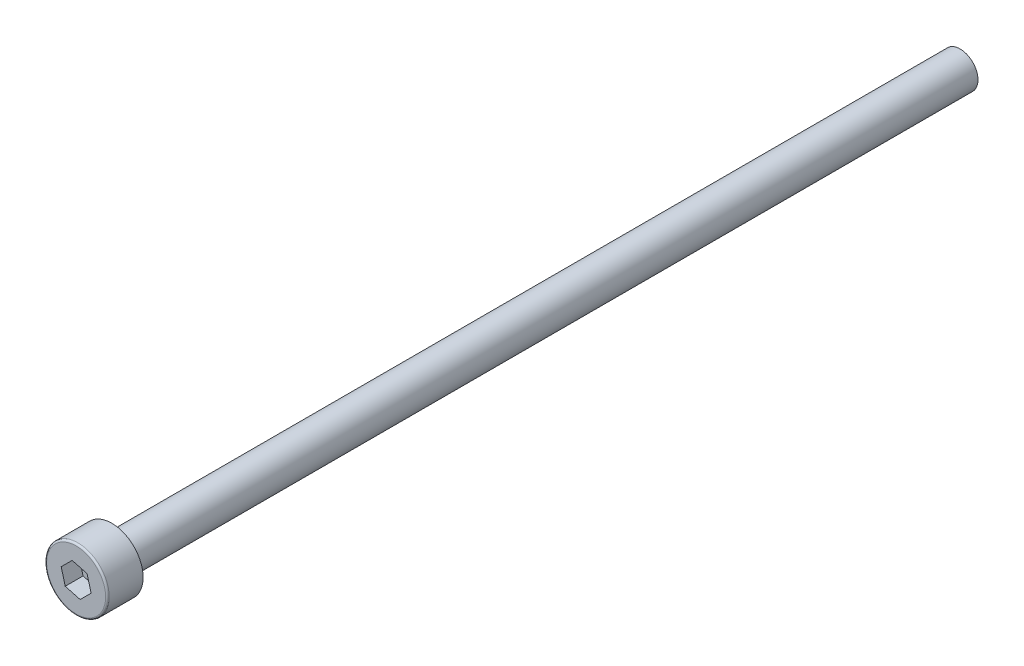
ISO-10303-21;
HEADER;
FILE_DESCRIPTION(('STEP AP214'),'2;1');
FILE_NAME('part.step','',(''),(''),'','','');
FILE_SCHEMA(('AUTOMOTIVE_DESIGN { 1 0 10303 214 1 1 1 1 }'));
ENDSEC;
DATA;
#1=APPLICATION_CONTEXT('core data for automotive mechanical design processes');
#2=APPLICATION_PROTOCOL_DEFINITION('international standard','automotive_design',2000,#1);
#3=PRODUCT_CONTEXT('',#1,'mechanical');
#4=PRODUCT('Part','Part','',(#3));
#5=PRODUCT_RELATED_PRODUCT_CATEGORY('part','',(#4));
#6=PRODUCT_DEFINITION_FORMATION('','',#4);
#7=PRODUCT_DEFINITION_CONTEXT('part definition',#1,'design');
#8=PRODUCT_DEFINITION('design','',#6,#7);
#9=PRODUCT_DEFINITION_SHAPE('','',#8);
#10=(LENGTH_UNIT() NAMED_UNIT(*) SI_UNIT(.MILLI.,.METRE.));
#11=(NAMED_UNIT(*) PLANE_ANGLE_UNIT() SI_UNIT($,.RADIAN.));
#12=(NAMED_UNIT(*) SI_UNIT($,.STERADIAN.) SOLID_ANGLE_UNIT());
#13=UNCERTAINTY_MEASURE_WITH_UNIT(LENGTH_MEASURE(1.E-05),#10,'distance_accuracy_value','');
#14=(GEOMETRIC_REPRESENTATION_CONTEXT(3) GLOBAL_UNCERTAINTY_ASSIGNED_CONTEXT((#13)) GLOBAL_UNIT_ASSIGNED_CONTEXT((#10,
#11,#12)) REPRESENTATION_CONTEXT('',''));
#15=CARTESIAN_POINT('',(0.,0.,0.));
#16=DIRECTION('',(0.,0.,1.));
#17=DIRECTION('',(1.,0.,0.));
#18=AXIS2_PLACEMENT_3D('',#15,#16,#17);
#19=CARTESIAN_POINT('',(0.,0.,0.));
#20=DIRECTION('',(0.,0.,1.));
#21=DIRECTION('',(1.,0.,0.));
#22=AXIS2_PLACEMENT_3D('',#19,#20,#21);
#23=PLANE('',#22);
#24=CARTESIAN_POINT('',(0.,0.,0.));
#25=DIRECTION('',(0.,0.,1.));
#26=DIRECTION('',(1.,0.,0.));
#27=AXIS2_PLACEMENT_3D('',#24,#25,#26);
#28=CIRCLE('',#27,3.5);
#29=CARTESIAN_POINT('',(3.5,0.,0.));
#30=VERTEX_POINT('',#29);
#31=EDGE_CURVE('E138',#30,#30,#28,.T.);
#32=ORIENTED_EDGE('',*,*,#31,.F.);
#33=EDGE_LOOP('',(#32));
#34=FACE_BOUND('',#33,.T.);
#35=CARTESIAN_POINT('',(0.,0.,0.));
#36=DIRECTION('',(0.,0.,1.));
#37=DIRECTION('',(1.,0.,0.));
#38=AXIS2_PLACEMENT_3D('',#35,#36,#37);
#39=CIRCLE('',#38,2.);
#40=CARTESIAN_POINT('',(2.,0.,0.));
#41=VERTEX_POINT('',#40);
#42=EDGE_CURVE('E146',#41,#41,#39,.F.);
#43=ORIENTED_EDGE('',*,*,#42,.F.);
#44=EDGE_LOOP('',(#43));
#45=FACE_BOUND('',#44,.T.);
#46=ADVANCED_FACE('F35',(#34,#45),#23,.F.);
#47=CARTESIAN_POINT('',(0.,0.,4.));
#48=DIRECTION('',(0.,0.,-1.));
#49=DIRECTION('',(-1.,0.,0.));
#50=AXIS2_PLACEMENT_3D('',#47,#48,#49);
#51=CYLINDRICAL_SURFACE('',#50,3.5);
#52=CARTESIAN_POINT('',(0.,0.,3.8));
#53=DIRECTION('',(0.,0.,1.));
#54=DIRECTION('',(1.,0.,0.));
#55=AXIS2_PLACEMENT_3D('',#52,#53,#54);
#56=CIRCLE('',#55,3.5);
#57=CARTESIAN_POINT('',(3.5,0.,3.8));
#58=VERTEX_POINT('',#57);
#59=EDGE_CURVE('E11',#58,#58,#56,.F.);
#60=ORIENTED_EDGE('',*,*,#59,.T.);
#61=EDGE_LOOP('',(#60));
#62=FACE_BOUND('',#61,.T.);
#63=ORIENTED_EDGE('',*,*,#31,.T.);
#64=EDGE_LOOP('',(#63));
#65=FACE_BOUND('',#64,.T.);
#66=ADVANCED_FACE('F165',(#62,#65),#51,.T.);
#67=CARTESIAN_POINT('',(0.,0.,4.));
#68=DIRECTION('',(0.,0.,1.));
#69=DIRECTION('',(1.,0.,0.));
#70=AXIS2_PLACEMENT_3D('',#67,#68,#69);
#71=PLANE('',#70);
#72=CARTESIAN_POINT('',(0.,0.,4.));
#73=DIRECTION('',(0.,0.,1.));
#74=DIRECTION('',(1.,0.,0.));
#75=AXIS2_PLACEMENT_3D('',#72,#73,#74);
#76=CIRCLE('',#75,3.3);
#77=CARTESIAN_POINT('',(3.3,0.,4.));
#78=VERTEX_POINT('',#77);
#79=EDGE_CURVE('E43',#78,#78,#76,.T.);
#80=ORIENTED_EDGE('',*,*,#79,.T.);
#81=EDGE_LOOP('',(#80));
#82=FACE_BOUND('',#81,.T.);
#83=DIRECTION('',(0.258819045102521,-0.965925826289068,0.));
#84=VECTOR('',#83,1.);
#85=CARTESIAN_POINT('',(-1.67303260747562,0.448287736084027,4.));
#86=LINE('',#85,#84);
#87=CARTESIAN_POINT('',(-1.67303260747562,0.448287736084027,4.));
#88=VERTEX_POINT('',#87);
#89=CARTESIAN_POINT('',(-1.22474487139159,-1.22474487139159,4.));
#90=VERTEX_POINT('',#89);
#91=EDGE_CURVE('E50',#88,#90,#86,.T.);
#92=ORIENTED_EDGE('',*,*,#91,.F.);
#93=DIRECTION('',(-0.707106781186547,-0.707106781186548,0.));
#94=VECTOR('',#93,1.);
#95=CARTESIAN_POINT('',(-0.448287736084027,1.67303260747562,4.));
#96=LINE('',#95,#94);
#97=CARTESIAN_POINT('',(-0.448287736084027,1.67303260747562,4.));
#98=VERTEX_POINT('',#97);
#99=EDGE_CURVE('E134',#98,#88,#96,.T.);
#100=ORIENTED_EDGE('',*,*,#99,.F.);
#101=DIRECTION('',(-0.965925826289068,0.258819045102521,0.));
#102=VECTOR('',#101,1.);
#103=CARTESIAN_POINT('',(1.22474487139159,1.22474487139159,4.));
#104=LINE('',#103,#102);
#105=CARTESIAN_POINT('',(1.22474487139159,1.22474487139159,4.));
#106=VERTEX_POINT('',#105);
#107=EDGE_CURVE('E132',#106,#98,#104,.T.);
#108=ORIENTED_EDGE('',*,*,#107,.F.);
#109=DIRECTION('',(-0.258819045102521,0.965925826289068,0.));
#110=VECTOR('',#109,1.);
#111=CARTESIAN_POINT('',(1.67303260747562,-0.448287736084027,4.));
#112=LINE('',#111,#110);
#113=CARTESIAN_POINT('',(1.67303260747562,-0.448287736084027,4.));
#114=VERTEX_POINT('',#113);
#115=EDGE_CURVE('E98',#114,#106,#112,.T.);
#116=ORIENTED_EDGE('',*,*,#115,.F.);
#117=DIRECTION('',(0.707106781186547,0.707106781186548,0.));
#118=VECTOR('',#117,1.);
#119=CARTESIAN_POINT('',(0.448287736084026,-1.67303260747562,4.));
#120=LINE('',#119,#118);
#121=CARTESIAN_POINT('',(0.448287736084026,-1.67303260747562,4.));
#122=VERTEX_POINT('',#121);
#123=EDGE_CURVE('E128',#122,#114,#120,.T.);
#124=ORIENTED_EDGE('',*,*,#123,.F.);
#125=DIRECTION('',(0.965925826289068,-0.258819045102521,0.));
#126=VECTOR('',#125,1.);
#127=CARTESIAN_POINT('',(-1.22474487139159,-1.22474487139159,4.));
#128=LINE('',#127,#126);
#129=EDGE_CURVE('E124',#90,#122,#128,.T.);
#130=ORIENTED_EDGE('',*,*,#129,.F.);
#131=EDGE_LOOP('',(#92,#100,#108,#116,#124,#130));
#132=FACE_BOUND('',#131,.T.);
#133=ADVANCED_FACE('F151',(#82,#132),#71,.T.);
#134=CARTESIAN_POINT('',(-1.67303260747562,0.448287736084027,2.));
#135=DIRECTION('',(-0.965925826289068,-0.258819045102521,0.));
#136=DIRECTION('',(0.258819045102521,-0.965925826289068,0.));
#137=AXIS2_PLACEMENT_3D('',#134,#135,#136);
#138=PLANE('',#137);
#139=ORIENTED_EDGE('',*,*,#91,.T.);
#140=DIRECTION('',(0.,0.,1.));
#141=VECTOR('',#140,1.);
#142=CARTESIAN_POINT('',(-1.22474487139159,-1.22474487139159,2.));
#143=LINE('',#142,#141);
#144=CARTESIAN_POINT('',(-1.22474487139159,-1.22474487139159,2.));
#145=VERTEX_POINT('',#144);
#146=EDGE_CURVE('E80',#145,#90,#143,.T.);
#147=ORIENTED_EDGE('',*,*,#146,.F.);
#148=DIRECTION('',(0.258819045102521,-0.965925826289068,0.));
#149=VECTOR('',#148,1.);
#150=CARTESIAN_POINT('',(-1.67303260747562,0.448287736084027,2.));
#151=LINE('',#150,#149);
#152=CARTESIAN_POINT('',(-1.67303260747562,0.448287736084027,2.));
#153=VERTEX_POINT('',#152);
#154=EDGE_CURVE('E136',#153,#145,#151,.T.);
#155=ORIENTED_EDGE('',*,*,#154,.F.);
#156=DIRECTION('',(0.,0.,1.));
#157=VECTOR('',#156,1.);
#158=CARTESIAN_POINT('',(-1.67303260747562,0.448287736084027,2.));
#159=LINE('',#158,#157);
#160=EDGE_CURVE('E58',#153,#88,#159,.T.);
#161=ORIENTED_EDGE('',*,*,#160,.T.);
#162=EDGE_LOOP('',(#139,#147,#155,#161));
#163=FACE_BOUND('',#162,.T.);
#164=ADVANCED_FACE('F177',(#163),#138,.F.);
#165=CARTESIAN_POINT('',(-0.448287736084027,1.67303260747562,2.));
#166=DIRECTION('',(-0.707106781186548,0.707106781186547,0.));
#167=DIRECTION('',(-0.707106781186547,-0.707106781186548,0.));
#168=AXIS2_PLACEMENT_3D('',#165,#166,#167);
#169=PLANE('',#168);
#170=ORIENTED_EDGE('',*,*,#99,.T.);
#171=ORIENTED_EDGE('',*,*,#160,.F.);
#172=DIRECTION('',(-0.707106781186547,-0.707106781186548,0.));
#173=VECTOR('',#172,1.);
#174=CARTESIAN_POINT('',(-0.448287736084027,1.67303260747562,2.));
#175=LINE('',#174,#173);
#176=CARTESIAN_POINT('',(-0.448287736084027,1.67303260747562,2.));
#177=VERTEX_POINT('',#176);
#178=EDGE_CURVE('E110',#177,#153,#175,.T.);
#179=ORIENTED_EDGE('',*,*,#178,.F.);
#180=DIRECTION('',(0.,0.,1.));
#181=VECTOR('',#180,1.);
#182=CARTESIAN_POINT('',(-0.448287736084027,1.67303260747562,2.));
#183=LINE('',#182,#181);
#184=EDGE_CURVE('E102',#177,#98,#183,.T.);
#185=ORIENTED_EDGE('',*,*,#184,.T.);
#186=EDGE_LOOP('',(#170,#171,#179,#185));
#187=FACE_BOUND('',#186,.T.);
#188=ADVANCED_FACE('F180',(#187),#169,.F.);
#189=CARTESIAN_POINT('',(1.22474487139159,1.22474487139159,2.));
#190=DIRECTION('',(0.258819045102521,0.965925826289068,0.));
#191=DIRECTION('',(-0.965925826289068,0.258819045102521,0.));
#192=AXIS2_PLACEMENT_3D('',#189,#190,#191);
#193=PLANE('',#192);
#194=ORIENTED_EDGE('',*,*,#107,.T.);
#195=ORIENTED_EDGE('',*,*,#184,.F.);
#196=DIRECTION('',(-0.965925826289068,0.258819045102521,0.));
#197=VECTOR('',#196,1.);
#198=CARTESIAN_POINT('',(1.22474487139159,1.22474487139159,2.));
#199=LINE('',#198,#197);
#200=CARTESIAN_POINT('',(1.22474487139159,1.22474487139159,2.));
#201=VERTEX_POINT('',#200);
#202=EDGE_CURVE('E106',#201,#177,#199,.T.);
#203=ORIENTED_EDGE('',*,*,#202,.F.);
#204=DIRECTION('',(0.,0.,1.));
#205=VECTOR('',#204,1.);
#206=CARTESIAN_POINT('',(1.22474487139159,1.22474487139159,2.));
#207=LINE('',#206,#205);
#208=EDGE_CURVE('E91',#201,#106,#207,.T.);
#209=ORIENTED_EDGE('',*,*,#208,.T.);
#210=EDGE_LOOP('',(#194,#195,#203,#209));
#211=FACE_BOUND('',#210,.T.);
#212=ADVANCED_FACE('F107',(#211),#193,.F.);
#213=CARTESIAN_POINT('',(1.67303260747562,-0.448287736084027,2.));
#214=DIRECTION('',(0.965925826289068,0.258819045102521,0.));
#215=DIRECTION('',(-0.258819045102521,0.965925826289068,0.));
#216=AXIS2_PLACEMENT_3D('',#213,#214,#215);
#217=PLANE('',#216);
#218=ORIENTED_EDGE('',*,*,#115,.T.);
#219=ORIENTED_EDGE('',*,*,#208,.F.);
#220=DIRECTION('',(-0.258819045102521,0.965925826289068,0.));
#221=VECTOR('',#220,1.);
#222=CARTESIAN_POINT('',(1.67303260747562,-0.448287736084027,2.));
#223=LINE('',#222,#221);
#224=CARTESIAN_POINT('',(1.67303260747562,-0.448287736084027,2.));
#225=VERTEX_POINT('',#224);
#226=EDGE_CURVE('E95',#225,#201,#223,.T.);
#227=ORIENTED_EDGE('',*,*,#226,.F.);
#228=DIRECTION('',(0.,0.,1.));
#229=VECTOR('',#228,1.);
#230=CARTESIAN_POINT('',(1.67303260747562,-0.448287736084027,2.));
#231=LINE('',#230,#229);
#232=EDGE_CURVE('E103',#225,#114,#231,.T.);
#233=ORIENTED_EDGE('',*,*,#232,.T.);
#234=EDGE_LOOP('',(#218,#219,#227,#233));
#235=FACE_BOUND('',#234,.T.);
#236=ADVANCED_FACE('F93',(#235),#217,.F.);
#237=CARTESIAN_POINT('',(0.448287736084026,-1.67303260747562,2.));
#238=DIRECTION('',(0.707106781186548,-0.707106781186547,0.));
#239=DIRECTION('',(0.707106781186547,0.707106781186548,0.));
#240=AXIS2_PLACEMENT_3D('',#237,#238,#239);
#241=PLANE('',#240);
#242=ORIENTED_EDGE('',*,*,#123,.T.);
#243=ORIENTED_EDGE('',*,*,#232,.F.);
#244=DIRECTION('',(0.707106781186547,0.707106781186548,0.));
#245=VECTOR('',#244,1.);
#246=CARTESIAN_POINT('',(0.448287736084026,-1.67303260747562,2.));
#247=LINE('',#246,#245);
#248=CARTESIAN_POINT('',(0.448287736084026,-1.67303260747562,2.));
#249=VERTEX_POINT('',#248);
#250=EDGE_CURVE('E116',#249,#225,#247,.T.);
#251=ORIENTED_EDGE('',*,*,#250,.F.);
#252=DIRECTION('',(0.,0.,1.));
#253=VECTOR('',#252,1.);
#254=CARTESIAN_POINT('',(0.448287736084026,-1.67303260747562,2.));
#255=LINE('',#254,#253);
#256=EDGE_CURVE('E141',#249,#122,#255,.T.);
#257=ORIENTED_EDGE('',*,*,#256,.T.);
#258=EDGE_LOOP('',(#242,#243,#251,#257));
#259=FACE_BOUND('',#258,.T.);
#260=ADVANCED_FACE('F184',(#259),#241,.F.);
#261=CARTESIAN_POINT('',(-1.22474487139159,-1.22474487139159,2.));
#262=DIRECTION('',(-0.258819045102521,-0.965925826289068,0.));
#263=DIRECTION('',(0.965925826289068,-0.258819045102521,0.));
#264=AXIS2_PLACEMENT_3D('',#261,#262,#263);
#265=PLANE('',#264);
#266=ORIENTED_EDGE('',*,*,#129,.T.);
#267=ORIENTED_EDGE('',*,*,#256,.F.);
#268=DIRECTION('',(0.965925826289068,-0.258819045102521,0.));
#269=VECTOR('',#268,1.);
#270=CARTESIAN_POINT('',(-1.22474487139159,-1.22474487139159,2.));
#271=LINE('',#270,#269);
#272=EDGE_CURVE('E118',#145,#249,#271,.T.);
#273=ORIENTED_EDGE('',*,*,#272,.F.);
#274=ORIENTED_EDGE('',*,*,#146,.T.);
#275=EDGE_LOOP('',(#266,#267,#273,#274));
#276=FACE_BOUND('',#275,.T.);
#277=ADVANCED_FACE('F181',(#276),#265,.F.);
#278=CARTESIAN_POINT('',(0.,0.,2.));
#279=DIRECTION('',(0.,0.,1.));
#280=DIRECTION('',(1.,0.,0.));
#281=AXIS2_PLACEMENT_3D('',#278,#279,#280);
#282=PLANE('',#281);
#283=ORIENTED_EDGE('',*,*,#154,.T.);
#284=ORIENTED_EDGE('',*,*,#272,.T.);
#285=ORIENTED_EDGE('',*,*,#250,.T.);
#286=ORIENTED_EDGE('',*,*,#226,.T.);
#287=ORIENTED_EDGE('',*,*,#202,.T.);
#288=ORIENTED_EDGE('',*,*,#178,.T.);
#289=EDGE_LOOP('',(#283,#284,#285,#286,#287,#288));
#290=FACE_BOUND('',#289,.T.);
#291=ADVANCED_FACE('F113',(#290),#282,.T.);
#292=CARTESIAN_POINT('',(0.,0.,-95.));
#293=DIRECTION('',(0.,0.,1.));
#294=DIRECTION('',(1.,0.,0.));
#295=AXIS2_PLACEMENT_3D('',#292,#293,#294);
#296=CYLINDRICAL_SURFACE('',#295,2.);
#297=CARTESIAN_POINT('',(0.,0.,-95.));
#298=DIRECTION('',(0.,0.,-1.));
#299=DIRECTION('',(-1.,0.,0.));
#300=AXIS2_PLACEMENT_3D('',#297,#298,#299);
#301=CIRCLE('',#300,2.);
#302=CARTESIAN_POINT('',(-2.,0.,-95.));
#303=VERTEX_POINT('',#302);
#304=EDGE_CURVE('E125',#303,#303,#301,.T.);
#305=ORIENTED_EDGE('',*,*,#304,.F.);
#306=EDGE_LOOP('',(#305));
#307=FACE_BOUND('',#306,.T.);
#308=ORIENTED_EDGE('',*,*,#42,.T.);
#309=EDGE_LOOP('',(#308));
#310=FACE_BOUND('',#309,.T.);
#311=ADVANCED_FACE('F160',(#307,#310),#296,.T.);
#312=CARTESIAN_POINT('',(0.,0.,-95.));
#313=DIRECTION('',(0.,0.,-1.));
#314=DIRECTION('',(-1.,0.,0.));
#315=AXIS2_PLACEMENT_3D('',#312,#313,#314);
#316=PLANE('',#315);
#317=ORIENTED_EDGE('',*,*,#304,.T.);
#318=EDGE_LOOP('',(#317));
#319=FACE_BOUND('',#318,.T.);
#320=ADVANCED_FACE('F155',(#319),#316,.T.);
#321=CARTESIAN_POINT('',(0.,0.,3.8));
#322=DIRECTION('',(0.,0.,1.));
#323=DIRECTION('',(1.,0.,0.));
#324=AXIS2_PLACEMENT_3D('',#321,#322,#323);
#325=TOROIDAL_SURFACE('',#324,3.3,0.2);
#326=ORIENTED_EDGE('',*,*,#59,.F.);
#327=EDGE_LOOP('',(#326));
#328=FACE_BOUND('',#327,.T.);
#329=ORIENTED_EDGE('',*,*,#79,.F.);
#330=EDGE_LOOP('',(#329));
#331=FACE_BOUND('',#330,.T.);
#332=ADVANCED_FACE('F37',(#328,#331),#325,.T.);
#333=CLOSED_SHELL('',(#46,#66,#133,#164,#188,#212,#236,#260,#277,#291,#311,#320,#332));
#334=MANIFOLD_SOLID_BREP('B2',#333);
#335=ADVANCED_BREP_SHAPE_REPRESENTATION('',(#18,#334),#14);
#336=SHAPE_DEFINITION_REPRESENTATION(#9,#335);
ENDSEC;
END-ISO-10303-21;
